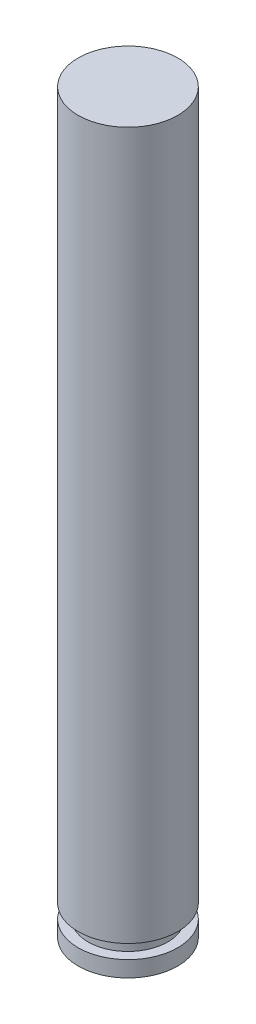
ISO-10303-21;
HEADER;
FILE_DESCRIPTION(('STEP AP214'),'2;1');
FILE_NAME('part.step','',(''),(''),'','','');
FILE_SCHEMA(('AUTOMOTIVE_DESIGN { 1 0 10303 214 1 1 1 1 }'));
ENDSEC;
DATA;
#1=APPLICATION_CONTEXT('core data for automotive mechanical design processes');
#2=APPLICATION_PROTOCOL_DEFINITION('international standard','automotive_design',2000,#1);
#3=PRODUCT_CONTEXT('',#1,'mechanical');
#4=PRODUCT('Part','Part','',(#3));
#5=PRODUCT_RELATED_PRODUCT_CATEGORY('part','',(#4));
#6=PRODUCT_DEFINITION_FORMATION('','',#4);
#7=PRODUCT_DEFINITION_CONTEXT('part definition',#1,'design');
#8=PRODUCT_DEFINITION('design','',#6,#7);
#9=PRODUCT_DEFINITION_SHAPE('','',#8);
#10=(LENGTH_UNIT() NAMED_UNIT(*) SI_UNIT(.MILLI.,.METRE.));
#11=(NAMED_UNIT(*) PLANE_ANGLE_UNIT() SI_UNIT($,.RADIAN.));
#12=(NAMED_UNIT(*) SI_UNIT($,.STERADIAN.) SOLID_ANGLE_UNIT());
#13=UNCERTAINTY_MEASURE_WITH_UNIT(LENGTH_MEASURE(1.E-05),#10,'distance_accuracy_value','');
#14=(GEOMETRIC_REPRESENTATION_CONTEXT(3) GLOBAL_UNCERTAINTY_ASSIGNED_CONTEXT((#13)) GLOBAL_UNIT_ASSIGNED_CONTEXT((#10,
#11,#12)) REPRESENTATION_CONTEXT('',''));
#15=CARTESIAN_POINT('',(0.,0.,0.));
#16=DIRECTION('',(0.,0.,1.));
#17=DIRECTION('',(1.,0.,0.));
#18=AXIS2_PLACEMENT_3D('',#15,#16,#17);
#19=CARTESIAN_POINT('',(0.,-34.,-2.50000000000001));
#20=DIRECTION('',(0.,1.,0.));
#21=DIRECTION('',(0.,0.,1.));
#22=AXIS2_PLACEMENT_3D('',#19,#20,#21);
#23=PLANE('',#22);
#24=CARTESIAN_POINT('',(0.,-34.,0.));
#25=DIRECTION('',(0.,1.,0.));
#26=DIRECTION('',(0.,0.,1.));
#27=AXIS2_PLACEMENT_3D('',#24,#25,#26);
#28=CIRCLE('',#27,2.50000000000001);
#29=CARTESIAN_POINT('',(0.,-34.,2.50000000000001));
#30=VERTEX_POINT('',#29);
#31=EDGE_CURVE('E18',#30,#30,#28,.T.);
#32=ORIENTED_EDGE('',*,*,#31,.F.);
#33=EDGE_LOOP('',(#32));
#34=FACE_BOUND('',#33,.T.);
#35=ADVANCED_FACE('F15',(#34),#23,.F.);
#36=CARTESIAN_POINT('',(0.,45.2878412997973,0.));
#37=DIRECTION('',(0.,1.,0.));
#38=DIRECTION('',(0.,0.,1.));
#39=AXIS2_PLACEMENT_3D('',#36,#37,#38);
#40=CYLINDRICAL_SURFACE('',#39,2.50000000000001);
#41=CARTESIAN_POINT('',(0.,-33.2,0.));
#42=DIRECTION('',(0.,1.,0.));
#43=DIRECTION('',(0.,0.,1.));
#44=AXIS2_PLACEMENT_3D('',#41,#42,#43);
#45=CIRCLE('',#44,2.50000000000001);
#46=CARTESIAN_POINT('',(0.,-33.2,2.50000000000001));
#47=VERTEX_POINT('',#46);
#48=EDGE_CURVE('E34',#47,#47,#45,.F.);
#49=ORIENTED_EDGE('',*,*,#48,.T.);
#50=EDGE_LOOP('',(#49));
#51=FACE_BOUND('',#50,.T.);
#52=ORIENTED_EDGE('',*,*,#31,.T.);
#53=EDGE_LOOP('',(#52));
#54=FACE_BOUND('',#53,.T.);
#55=ADVANCED_FACE('F41',(#51,#54),#40,.T.);
#56=CARTESIAN_POINT('',(0.,-33.2,-2.00000000000001));
#57=DIRECTION('',(0.,-1.,0.));
#58=DIRECTION('',(0.,0.,-1.));
#59=AXIS2_PLACEMENT_3D('',#56,#57,#58);
#60=PLANE('',#59);
#61=ORIENTED_EDGE('',*,*,#48,.F.);
#62=EDGE_LOOP('',(#61));
#63=FACE_BOUND('',#62,.T.);
#64=CARTESIAN_POINT('',(0.,-33.2,0.));
#65=DIRECTION('',(0.,1.,0.));
#66=DIRECTION('',(0.,0.,1.));
#67=AXIS2_PLACEMENT_3D('',#64,#65,#66);
#68=CIRCLE('',#67,2.00000000000001);
#69=CARTESIAN_POINT('',(0.,-33.2,2.00000000000001));
#70=VERTEX_POINT('',#69);
#71=EDGE_CURVE('E32',#70,#70,#68,.T.);
#72=ORIENTED_EDGE('',*,*,#71,.F.);
#73=EDGE_LOOP('',(#72));
#74=FACE_BOUND('',#73,.T.);
#75=ADVANCED_FACE('F48',(#63,#74),#60,.F.);
#76=CARTESIAN_POINT('',(0.,45.2878412997973,0.));
#77=DIRECTION('',(0.,1.,0.));
#78=DIRECTION('',(0.,0.,1.));
#79=AXIS2_PLACEMENT_3D('',#76,#77,#78);
#80=CYLINDRICAL_SURFACE('',#79,2.00000000000001);
#81=CARTESIAN_POINT('',(0.,-32.5,0.));
#82=DIRECTION('',(0.,1.,0.));
#83=DIRECTION('',(0.,0.,1.));
#84=AXIS2_PLACEMENT_3D('',#81,#82,#83);
#85=CIRCLE('',#84,2.00000000000001);
#86=CARTESIAN_POINT('',(0.,-32.5,2.00000000000001));
#87=VERTEX_POINT('',#86);
#88=EDGE_CURVE('E27',#87,#87,#85,.F.);
#89=ORIENTED_EDGE('',*,*,#88,.T.);
#90=EDGE_LOOP('',(#89));
#91=FACE_BOUND('',#90,.T.);
#92=ORIENTED_EDGE('',*,*,#71,.T.);
#93=EDGE_LOOP('',(#92));
#94=FACE_BOUND('',#93,.T.);
#95=ADVANCED_FACE('F63',(#91,#94),#80,.T.);
#96=CARTESIAN_POINT('',(0.,-32.5,-2.50000000000001));
#97=DIRECTION('',(0.,1.,0.));
#98=DIRECTION('',(0.,0.,1.));
#99=AXIS2_PLACEMENT_3D('',#96,#97,#98);
#100=PLANE('',#99);
#101=ORIENTED_EDGE('',*,*,#88,.F.);
#102=EDGE_LOOP('',(#101));
#103=FACE_BOUND('',#102,.T.);
#104=CARTESIAN_POINT('',(0.,-32.5,0.));
#105=DIRECTION('',(0.,1.,0.));
#106=DIRECTION('',(0.,0.,1.));
#107=AXIS2_PLACEMENT_3D('',#104,#105,#106);
#108=CIRCLE('',#107,2.50000000000001);
#109=CARTESIAN_POINT('',(0.,-32.5,2.50000000000001));
#110=VERTEX_POINT('',#109);
#111=EDGE_CURVE('E22',#110,#110,#108,.T.);
#112=ORIENTED_EDGE('',*,*,#111,.F.);
#113=EDGE_LOOP('',(#112));
#114=FACE_BOUND('',#113,.T.);
#115=ADVANCED_FACE('F56',(#103,#114),#100,.F.);
#116=CARTESIAN_POINT('',(0.,3.,0.));
#117=DIRECTION('',(0.,1.,0.));
#118=DIRECTION('',(0.,0.,1.));
#119=AXIS2_PLACEMENT_3D('',#116,#117,#118);
#120=PLANE('',#119);
#121=CARTESIAN_POINT('',(0.,3.,0.));
#122=DIRECTION('',(0.,1.,0.));
#123=DIRECTION('',(0.,0.,1.));
#124=AXIS2_PLACEMENT_3D('',#121,#122,#123);
#125=CIRCLE('',#124,2.50000000000001);
#126=CARTESIAN_POINT('',(0.,3.,2.50000000000001));
#127=VERTEX_POINT('',#126);
#128=EDGE_CURVE('E10',#127,#127,#125,.F.);
#129=ORIENTED_EDGE('',*,*,#128,.F.);
#130=EDGE_LOOP('',(#129));
#131=FACE_BOUND('',#130,.T.);
#132=ADVANCED_FACE('F51',(#131),#120,.T.);
#133=CARTESIAN_POINT('',(0.,45.2878412997973,0.));
#134=DIRECTION('',(0.,1.,0.));
#135=DIRECTION('',(0.,0.,1.));
#136=AXIS2_PLACEMENT_3D('',#133,#134,#135);
#137=CYLINDRICAL_SURFACE('',#136,2.50000000000001);
#138=ORIENTED_EDGE('',*,*,#128,.T.);
#139=EDGE_LOOP('',(#138));
#140=FACE_BOUND('',#139,.T.);
#141=ORIENTED_EDGE('',*,*,#111,.T.);
#142=EDGE_LOOP('',(#141));
#143=FACE_BOUND('',#142,.T.);
#144=ADVANCED_FACE('F49',(#140,#143),#137,.T.);
#145=CLOSED_SHELL('',(#35,#55,#75,#95,#115,#132,#144));
#146=MANIFOLD_SOLID_BREP('B1',#145);
#147=ADVANCED_BREP_SHAPE_REPRESENTATION('',(#18,#146),#14);
#148=SHAPE_DEFINITION_REPRESENTATION(#9,#147);
ENDSEC;
END-ISO-10303-21;
